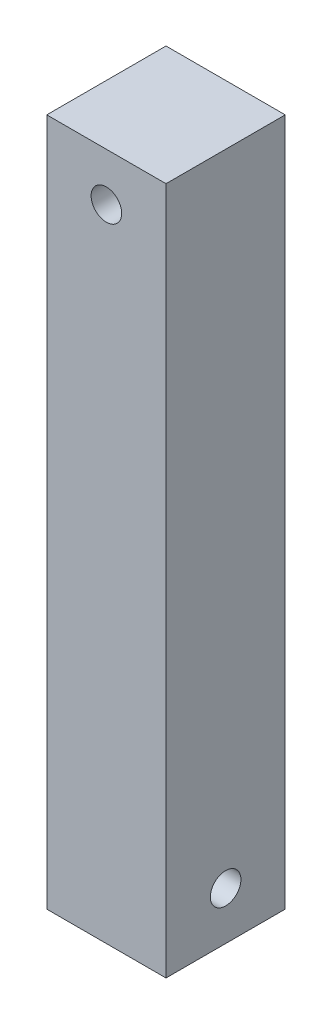
ISO-10303-21;
HEADER;
FILE_DESCRIPTION(('STEP AP214'),'2;1');
FILE_NAME('part.step','',(''),(''),'','','');
FILE_SCHEMA(('AUTOMOTIVE_DESIGN { 1 0 10303 214 1 1 1 1 }'));
ENDSEC;
DATA;
#1=APPLICATION_CONTEXT('core data for automotive mechanical design processes');
#2=APPLICATION_PROTOCOL_DEFINITION('international standard','automotive_design',2000,#1);
#3=PRODUCT_CONTEXT('',#1,'mechanical');
#4=PRODUCT('Part','Part','',(#3));
#5=PRODUCT_RELATED_PRODUCT_CATEGORY('part','',(#4));
#6=PRODUCT_DEFINITION_FORMATION('','',#4);
#7=PRODUCT_DEFINITION_CONTEXT('part definition',#1,'design');
#8=PRODUCT_DEFINITION('design','',#6,#7);
#9=PRODUCT_DEFINITION_SHAPE('','',#8);
#10=(LENGTH_UNIT() NAMED_UNIT(*) SI_UNIT(.MILLI.,.METRE.));
#11=(NAMED_UNIT(*) PLANE_ANGLE_UNIT() SI_UNIT($,.RADIAN.));
#12=(NAMED_UNIT(*) SI_UNIT($,.STERADIAN.) SOLID_ANGLE_UNIT());
#13=UNCERTAINTY_MEASURE_WITH_UNIT(LENGTH_MEASURE(1.E-05),#10,'distance_accuracy_value','');
#14=(GEOMETRIC_REPRESENTATION_CONTEXT(3) GLOBAL_UNCERTAINTY_ASSIGNED_CONTEXT((#13)) GLOBAL_UNIT_ASSIGNED_CONTEXT((#10,
#11,#12)) REPRESENTATION_CONTEXT('',''));
#15=CARTESIAN_POINT('',(0.,0.,0.));
#16=DIRECTION('',(0.,0.,1.));
#17=DIRECTION('',(1.,0.,0.));
#18=AXIS2_PLACEMENT_3D('',#15,#16,#17);
#19=CARTESIAN_POINT('',(5.85,67.5,-5.85));
#20=DIRECTION('',(-1.,0.,0.));
#21=DIRECTION('',(0.,0.,1.));
#22=AXIS2_PLACEMENT_3D('',#19,#20,#21);
#23=PLANE('',#22);
#24=CARTESIAN_POINT('',(5.85,4.7,0.));
#25=DIRECTION('',(1.,0.,0.));
#26=DIRECTION('',(0.,0.,-1.));
#27=AXIS2_PLACEMENT_3D('',#24,#25,#26);
#28=CIRCLE('',#27,1.5);
#29=CARTESIAN_POINT('',(5.85,4.7,-1.5));
#30=VERTEX_POINT('',#29);
#31=EDGE_CURVE('E142',#30,#30,#28,.T.);
#32=ORIENTED_EDGE('',*,*,#31,.F.);
#33=EDGE_LOOP('',(#32));
#34=FACE_BOUND('',#33,.T.);
#35=DIRECTION('',(0.,0.,-1.));
#36=VECTOR('',#35,1.);
#37=CARTESIAN_POINT('',(5.85,0.,-5.85));
#38=LINE('',#37,#36);
#39=CARTESIAN_POINT('',(5.85,0.,5.85));
#40=VERTEX_POINT('',#39);
#41=CARTESIAN_POINT('',(5.85,0.,-5.85));
#42=VERTEX_POINT('',#41);
#43=EDGE_CURVE('E171',#40,#42,#38,.T.);
#44=ORIENTED_EDGE('',*,*,#43,.T.);
#45=DIRECTION('',(0.,-1.,0.));
#46=VECTOR('',#45,1.);
#47=CARTESIAN_POINT('',(5.85,67.5,-5.85));
#48=LINE('',#47,#46);
#49=CARTESIAN_POINT('',(5.85,67.5,-5.85));
#50=VERTEX_POINT('',#49);
#51=EDGE_CURVE('E11',#50,#42,#48,.T.);
#52=ORIENTED_EDGE('',*,*,#51,.F.);
#53=DIRECTION('',(0.,0.,-1.));
#54=VECTOR('',#53,1.);
#55=CARTESIAN_POINT('',(5.85,67.5,-5.85));
#56=LINE('',#55,#54);
#57=CARTESIAN_POINT('',(5.85,67.5,5.85));
#58=VERTEX_POINT('',#57);
#59=EDGE_CURVE('E175',#58,#50,#56,.T.);
#60=ORIENTED_EDGE('',*,*,#59,.F.);
#61=DIRECTION('',(0.,-1.,0.));
#62=VECTOR('',#61,1.);
#63=CARTESIAN_POINT('',(5.85,67.5,5.85));
#64=LINE('',#63,#62);
#65=EDGE_CURVE('E185',#58,#40,#64,.T.);
#66=ORIENTED_EDGE('',*,*,#65,.T.);
#67=EDGE_LOOP('',(#44,#52,#60,#66));
#68=FACE_BOUND('',#67,.T.);
#69=ADVANCED_FACE('F38',(#34,#68),#23,.F.);
#70=CARTESIAN_POINT('',(-5.85,67.5,-5.85));
#71=DIRECTION('',(0.,0.,1.));
#72=DIRECTION('',(1.,0.,0.));
#73=AXIS2_PLACEMENT_3D('',#70,#71,#72);
#74=PLANE('',#73);
#75=DIRECTION('',(-1.,0.,0.));
#76=VECTOR('',#75,1.);
#77=CARTESIAN_POINT('',(2.21112710229819,14.4184316199073,-5.85));
#78=LINE('',#77,#76);
#79=CARTESIAN_POINT('',(2.21112710229819,14.4184316199073,-5.85));
#80=VERTEX_POINT('',#79);
#81=CARTESIAN_POINT('',(-0.568575540590963,14.4184316199073,-5.85));
#82=VERTEX_POINT('',#81);
#83=EDGE_CURVE('E151',#80,#82,#78,.T.);
#84=ORIENTED_EDGE('',*,*,#83,.F.);
#85=DIRECTION('',(0.,-1.,0.));
#86=VECTOR('',#85,1.);
#87=CARTESIAN_POINT('',(2.21112710229819,17.5771846231904,-5.85));
#88=LINE('',#87,#86);
#89=CARTESIAN_POINT('',(2.21112710229819,17.5771846231904,-5.85));
#90=VERTEX_POINT('',#89);
#91=EDGE_CURVE('E53',#90,#80,#88,.T.);
#92=ORIENTED_EDGE('',*,*,#91,.F.);
#93=DIRECTION('',(1.,0.,0.));
#94=VECTOR('',#93,1.);
#95=CARTESIAN_POINT('',(2.21112710229819,17.5771846231904,-5.85));
#96=LINE('',#95,#94);
#97=CARTESIAN_POINT('',(-0.568575540590963,17.5771846231904,-5.85));
#98=VERTEX_POINT('',#97);
#99=EDGE_CURVE('E135',#98,#90,#96,.T.);
#100=ORIENTED_EDGE('',*,*,#99,.F.);
#101=DIRECTION('',(0.,1.,0.));
#102=VECTOR('',#101,1.);
#103=CARTESIAN_POINT('',(-0.568575540590963,17.5771846231904,-5.85));
#104=LINE('',#103,#102);
#105=EDGE_CURVE('E139',#82,#98,#104,.T.);
#106=ORIENTED_EDGE('',*,*,#105,.F.);
#107=EDGE_LOOP('',(#84,#92,#100,#106));
#108=FACE_BOUND('',#107,.T.);
#109=CARTESIAN_POINT('',(0.,62.8,-5.85));
#110=DIRECTION('',(0.,0.,1.));
#111=DIRECTION('',(1.,0.,0.));
#112=AXIS2_PLACEMENT_3D('',#109,#110,#111);
#113=CIRCLE('',#112,1.5);
#114=CARTESIAN_POINT('',(1.5,62.8,-5.85));
#115=VERTEX_POINT('',#114);
#116=EDGE_CURVE('E167',#115,#115,#113,.T.);
#117=ORIENTED_EDGE('',*,*,#116,.T.);
#118=EDGE_LOOP('',(#117));
#119=FACE_BOUND('',#118,.T.);
#120=DIRECTION('',(-1.,0.,0.));
#121=VECTOR('',#120,1.);
#122=CARTESIAN_POINT('',(-5.85,0.,-5.85));
#123=LINE('',#122,#121);
#124=CARTESIAN_POINT('',(-5.85,0.,-5.85));
#125=VERTEX_POINT('',#124);
#126=EDGE_CURVE('E189',#42,#125,#123,.T.);
#127=ORIENTED_EDGE('',*,*,#126,.T.);
#128=DIRECTION('',(0.,-1.,0.));
#129=VECTOR('',#128,1.);
#130=CARTESIAN_POINT('',(-5.85,67.5,-5.85));
#131=LINE('',#130,#129);
#132=CARTESIAN_POINT('',(-5.85,67.5,-5.85));
#133=VERTEX_POINT('',#132);
#134=EDGE_CURVE('E46',#133,#125,#131,.T.);
#135=ORIENTED_EDGE('',*,*,#134,.F.);
#136=DIRECTION('',(-1.,0.,0.));
#137=VECTOR('',#136,1.);
#138=CARTESIAN_POINT('',(-5.85,67.5,-5.85));
#139=LINE('',#138,#137);
#140=EDGE_CURVE('E90',#50,#133,#139,.T.);
#141=ORIENTED_EDGE('',*,*,#140,.F.);
#142=ORIENTED_EDGE('',*,*,#51,.T.);
#143=EDGE_LOOP('',(#127,#135,#141,#142));
#144=FACE_BOUND('',#143,.T.);
#145=ADVANCED_FACE('F225',(#108,#119,#144),#74,.F.);
#146=CARTESIAN_POINT('',(-5.85,67.5,-5.85));
#147=DIRECTION('',(1.,0.,0.));
#148=DIRECTION('',(0.,0.,-1.));
#149=AXIS2_PLACEMENT_3D('',#146,#147,#148);
#150=PLANE('',#149);
#151=CARTESIAN_POINT('',(-5.85,4.7,0.));
#152=DIRECTION('',(1.,0.,0.));
#153=DIRECTION('',(0.,0.,-1.));
#154=AXIS2_PLACEMENT_3D('',#151,#152,#153);
#155=CIRCLE('',#154,1.5);
#156=CARTESIAN_POINT('',(-5.85,4.7,-1.5));
#157=VERTEX_POINT('',#156);
#158=EDGE_CURVE('E152',#157,#157,#155,.T.);
#159=ORIENTED_EDGE('',*,*,#158,.T.);
#160=EDGE_LOOP('',(#159));
#161=FACE_BOUND('',#160,.T.);
#162=DIRECTION('',(0.,0.,1.));
#163=VECTOR('',#162,1.);
#164=CARTESIAN_POINT('',(-5.85,0.,-5.85));
#165=LINE('',#164,#163);
#166=CARTESIAN_POINT('',(-5.85,0.,5.85));
#167=VERTEX_POINT('',#166);
#168=EDGE_CURVE('E192',#125,#167,#165,.T.);
#169=ORIENTED_EDGE('',*,*,#168,.T.);
#170=DIRECTION('',(0.,-1.,0.));
#171=VECTOR('',#170,1.);
#172=CARTESIAN_POINT('',(-5.85,67.5,5.85));
#173=LINE('',#172,#171);
#174=CARTESIAN_POINT('',(-5.85,67.5,5.85));
#175=VERTEX_POINT('',#174);
#176=EDGE_CURVE('E199',#175,#167,#173,.T.);
#177=ORIENTED_EDGE('',*,*,#176,.F.);
#178=DIRECTION('',(0.,0.,1.));
#179=VECTOR('',#178,1.);
#180=CARTESIAN_POINT('',(-5.85,67.5,-5.85));
#181=LINE('',#180,#179);
#182=EDGE_CURVE('E180',#133,#175,#181,.T.);
#183=ORIENTED_EDGE('',*,*,#182,.F.);
#184=ORIENTED_EDGE('',*,*,#134,.T.);
#185=EDGE_LOOP('',(#169,#177,#183,#184));
#186=FACE_BOUND('',#185,.T.);
#187=ADVANCED_FACE('F206',(#161,#186),#150,.F.);
#188=CARTESIAN_POINT('',(-5.85,67.5,5.85));
#189=DIRECTION('',(0.,0.,-1.));
#190=DIRECTION('',(-1.,0.,0.));
#191=AXIS2_PLACEMENT_3D('',#188,#189,#190);
#192=PLANE('',#191);
#193=CARTESIAN_POINT('',(0.,62.8,5.85));
#194=DIRECTION('',(0.,0.,1.));
#195=DIRECTION('',(1.,0.,0.));
#196=AXIS2_PLACEMENT_3D('',#193,#194,#195);
#197=CIRCLE('',#196,1.5);
#198=CARTESIAN_POINT('',(1.5,62.8,5.85));
#199=VERTEX_POINT('',#198);
#200=EDGE_CURVE('E161',#199,#199,#197,.T.);
#201=ORIENTED_EDGE('',*,*,#200,.F.);
#202=EDGE_LOOP('',(#201));
#203=FACE_BOUND('',#202,.T.);
#204=DIRECTION('',(1.,0.,0.));
#205=VECTOR('',#204,1.);
#206=CARTESIAN_POINT('',(-5.85,0.,5.85));
#207=LINE('',#206,#205);
#208=EDGE_CURVE('E83',#167,#40,#207,.T.);
#209=ORIENTED_EDGE('',*,*,#208,.T.);
#210=ORIENTED_EDGE('',*,*,#65,.F.);
#211=DIRECTION('',(1.,0.,0.));
#212=VECTOR('',#211,1.);
#213=CARTESIAN_POINT('',(-5.85,67.5,5.85));
#214=LINE('',#213,#212);
#215=EDGE_CURVE('E62',#175,#58,#214,.T.);
#216=ORIENTED_EDGE('',*,*,#215,.F.);
#217=ORIENTED_EDGE('',*,*,#176,.T.);
#218=EDGE_LOOP('',(#209,#210,#216,#217));
#219=FACE_BOUND('',#218,.T.);
#220=ADVANCED_FACE('F214',(#203,#219),#192,.F.);
#221=CARTESIAN_POINT('',(0.,67.5,0.));
#222=DIRECTION('',(0.,1.,0.));
#223=DIRECTION('',(0.,0.,1.));
#224=AXIS2_PLACEMENT_3D('',#221,#222,#223);
#225=PLANE('',#224);
#226=ORIENTED_EDGE('',*,*,#59,.T.);
#227=ORIENTED_EDGE('',*,*,#140,.T.);
#228=ORIENTED_EDGE('',*,*,#182,.T.);
#229=ORIENTED_EDGE('',*,*,#215,.T.);
#230=EDGE_LOOP('',(#226,#227,#228,#229));
#231=FACE_BOUND('',#230,.T.);
#232=ADVANCED_FACE('F216',(#231),#225,.T.);
#233=CARTESIAN_POINT('',(0.,0.,0.));
#234=DIRECTION('',(0.,1.,0.));
#235=DIRECTION('',(0.,0.,1.));
#236=AXIS2_PLACEMENT_3D('',#233,#234,#235);
#237=PLANE('',#236);
#238=ORIENTED_EDGE('',*,*,#43,.F.);
#239=ORIENTED_EDGE('',*,*,#208,.F.);
#240=ORIENTED_EDGE('',*,*,#168,.F.);
#241=ORIENTED_EDGE('',*,*,#126,.F.);
#242=EDGE_LOOP('',(#238,#239,#240,#241));
#243=FACE_BOUND('',#242,.T.);
#244=ADVANCED_FACE('F210',(#243),#237,.F.);
#245=CARTESIAN_POINT('',(0.,62.8,-5.85));
#246=DIRECTION('',(0.,0.,1.));
#247=DIRECTION('',(1.,0.,0.));
#248=AXIS2_PLACEMENT_3D('',#245,#246,#247);
#249=CYLINDRICAL_SURFACE('',#248,1.5);
#250=ORIENTED_EDGE('',*,*,#116,.F.);
#251=EDGE_LOOP('',(#250));
#252=FACE_BOUND('',#251,.T.);
#253=ORIENTED_EDGE('',*,*,#200,.T.);
#254=EDGE_LOOP('',(#253));
#255=FACE_BOUND('',#254,.T.);
#256=ADVANCED_FACE('F265',(#252,#255),#249,.F.);
#257=CARTESIAN_POINT('',(2.21112710229819,17.5771846231904,4.15));
#258=DIRECTION('',(1.,0.,0.));
#259=DIRECTION('',(0.,0.,-1.));
#260=AXIS2_PLACEMENT_3D('',#257,#258,#259);
#261=PLANE('',#260);
#262=ORIENTED_EDGE('',*,*,#91,.T.);
#263=DIRECTION('',(0.,0.,-1.));
#264=VECTOR('',#263,1.);
#265=CARTESIAN_POINT('',(2.21112710229819,14.4184316199073,4.15));
#266=LINE('',#265,#264);
#267=CARTESIAN_POINT('',(2.21112710229819,14.4184316199073,4.15));
#268=VERTEX_POINT('',#267);
#269=EDGE_CURVE('E110',#268,#80,#266,.T.);
#270=ORIENTED_EDGE('',*,*,#269,.F.);
#271=DIRECTION('',(0.,-1.,0.));
#272=VECTOR('',#271,1.);
#273=CARTESIAN_POINT('',(2.21112710229819,17.5771846231904,4.15));
#274=LINE('',#273,#272);
#275=CARTESIAN_POINT('',(2.21112710229819,17.5771846231904,4.15));
#276=VERTEX_POINT('',#275);
#277=EDGE_CURVE('E114',#276,#268,#274,.T.);
#278=ORIENTED_EDGE('',*,*,#277,.F.);
#279=DIRECTION('',(0.,0.,-1.));
#280=VECTOR('',#279,1.);
#281=CARTESIAN_POINT('',(2.21112710229819,17.5771846231904,4.15));
#282=LINE('',#281,#280);
#283=EDGE_CURVE('E158',#276,#90,#282,.T.);
#284=ORIENTED_EDGE('',*,*,#283,.T.);
#285=EDGE_LOOP('',(#262,#270,#278,#284));
#286=FACE_BOUND('',#285,.T.);
#287=ADVANCED_FACE('F112',(#286),#261,.F.);
#288=CARTESIAN_POINT('',(2.21112710229819,17.5771846231904,4.15));
#289=DIRECTION('',(0.,1.,0.));
#290=DIRECTION('',(0.,0.,1.));
#291=AXIS2_PLACEMENT_3D('',#288,#289,#290);
#292=PLANE('',#291);
#293=ORIENTED_EDGE('',*,*,#99,.T.);
#294=ORIENTED_EDGE('',*,*,#283,.F.);
#295=DIRECTION('',(1.,0.,0.));
#296=VECTOR('',#295,1.);
#297=CARTESIAN_POINT('',(2.21112710229819,17.5771846231904,4.15));
#298=LINE('',#297,#296);
#299=CARTESIAN_POINT('',(-0.568575540590963,17.5771846231904,4.15));
#300=VERTEX_POINT('',#299);
#301=EDGE_CURVE('E121',#300,#276,#298,.T.);
#302=ORIENTED_EDGE('',*,*,#301,.F.);
#303=DIRECTION('',(0.,0.,-1.));
#304=VECTOR('',#303,1.);
#305=CARTESIAN_POINT('',(-0.568575540590963,17.5771846231904,4.15));
#306=LINE('',#305,#304);
#307=EDGE_CURVE('E162',#300,#98,#306,.T.);
#308=ORIENTED_EDGE('',*,*,#307,.T.);
#309=EDGE_LOOP('',(#293,#294,#302,#308));
#310=FACE_BOUND('',#309,.T.);
#311=ADVANCED_FACE('F253',(#310),#292,.F.);
#312=CARTESIAN_POINT('',(-0.568575540590963,17.5771846231904,4.15));
#313=DIRECTION('',(-1.,0.,0.));
#314=DIRECTION('',(0.,0.,1.));
#315=AXIS2_PLACEMENT_3D('',#312,#313,#314);
#316=PLANE('',#315);
#317=ORIENTED_EDGE('',*,*,#105,.T.);
#318=ORIENTED_EDGE('',*,*,#307,.F.);
#319=DIRECTION('',(0.,1.,0.));
#320=VECTOR('',#319,1.);
#321=CARTESIAN_POINT('',(-0.568575540590963,17.5771846231904,4.15));
#322=LINE('',#321,#320);
#323=CARTESIAN_POINT('',(-0.568575540590963,14.4184316199073,4.15));
#324=VERTEX_POINT('',#323);
#325=EDGE_CURVE('E130',#324,#300,#322,.T.);
#326=ORIENTED_EDGE('',*,*,#325,.F.);
#327=DIRECTION('',(0.,0.,-1.));
#328=VECTOR('',#327,1.);
#329=CARTESIAN_POINT('',(-0.568575540590963,14.4184316199073,4.15));
#330=LINE('',#329,#328);
#331=EDGE_CURVE('E120',#324,#82,#330,.T.);
#332=ORIENTED_EDGE('',*,*,#331,.T.);
#333=EDGE_LOOP('',(#317,#318,#326,#332));
#334=FACE_BOUND('',#333,.T.);
#335=ADVANCED_FACE('F256',(#334),#316,.F.);
#336=CARTESIAN_POINT('',(2.21112710229819,14.4184316199073,4.15));
#337=DIRECTION('',(0.,-1.,0.));
#338=DIRECTION('',(0.,0.,-1.));
#339=AXIS2_PLACEMENT_3D('',#336,#337,#338);
#340=PLANE('',#339);
#341=ORIENTED_EDGE('',*,*,#83,.T.);
#342=ORIENTED_EDGE('',*,*,#331,.F.);
#343=DIRECTION('',(-1.,0.,0.));
#344=VECTOR('',#343,1.);
#345=CARTESIAN_POINT('',(2.21112710229819,14.4184316199073,4.15));
#346=LINE('',#345,#344);
#347=EDGE_CURVE('E124',#268,#324,#346,.T.);
#348=ORIENTED_EDGE('',*,*,#347,.F.);
#349=ORIENTED_EDGE('',*,*,#269,.T.);
#350=EDGE_LOOP('',(#341,#342,#348,#349));
#351=FACE_BOUND('',#350,.T.);
#352=ADVANCED_FACE('F125',(#351),#340,.F.);
#353=CARTESIAN_POINT('',(0.,0.,4.15));
#354=DIRECTION('',(0.,0.,-1.));
#355=DIRECTION('',(-1.,0.,0.));
#356=AXIS2_PLACEMENT_3D('',#353,#354,#355);
#357=PLANE('',#356);
#358=ORIENTED_EDGE('',*,*,#277,.T.);
#359=ORIENTED_EDGE('',*,*,#347,.T.);
#360=ORIENTED_EDGE('',*,*,#325,.T.);
#361=ORIENTED_EDGE('',*,*,#301,.T.);
#362=EDGE_LOOP('',(#358,#359,#360,#361));
#363=FACE_BOUND('',#362,.T.);
#364=ADVANCED_FACE('F132',(#363),#357,.T.);
#365=CARTESIAN_POINT('',(-5.85,4.7,0.));
#366=DIRECTION('',(1.,0.,0.));
#367=DIRECTION('',(0.,0.,-1.));
#368=AXIS2_PLACEMENT_3D('',#365,#366,#367);
#369=CYLINDRICAL_SURFACE('',#368,1.5);
#370=ORIENTED_EDGE('',*,*,#158,.F.);
#371=EDGE_LOOP('',(#370));
#372=FACE_BOUND('',#371,.T.);
#373=ORIENTED_EDGE('',*,*,#31,.T.);
#374=EDGE_LOOP('',(#373));
#375=FACE_BOUND('',#374,.T.);
#376=ADVANCED_FACE('F245',(#372,#375),#369,.F.);
#377=CLOSED_SHELL('',(#69,#145,#187,#220,#232,#244,#256,#287,#311,#335,#352,#364,#376));
#378=MANIFOLD_SOLID_BREP('B2',#377);
#379=ADVANCED_BREP_SHAPE_REPRESENTATION('',(#18,#378),#14);
#380=SHAPE_DEFINITION_REPRESENTATION(#9,#379);
ENDSEC;
END-ISO-10303-21;
